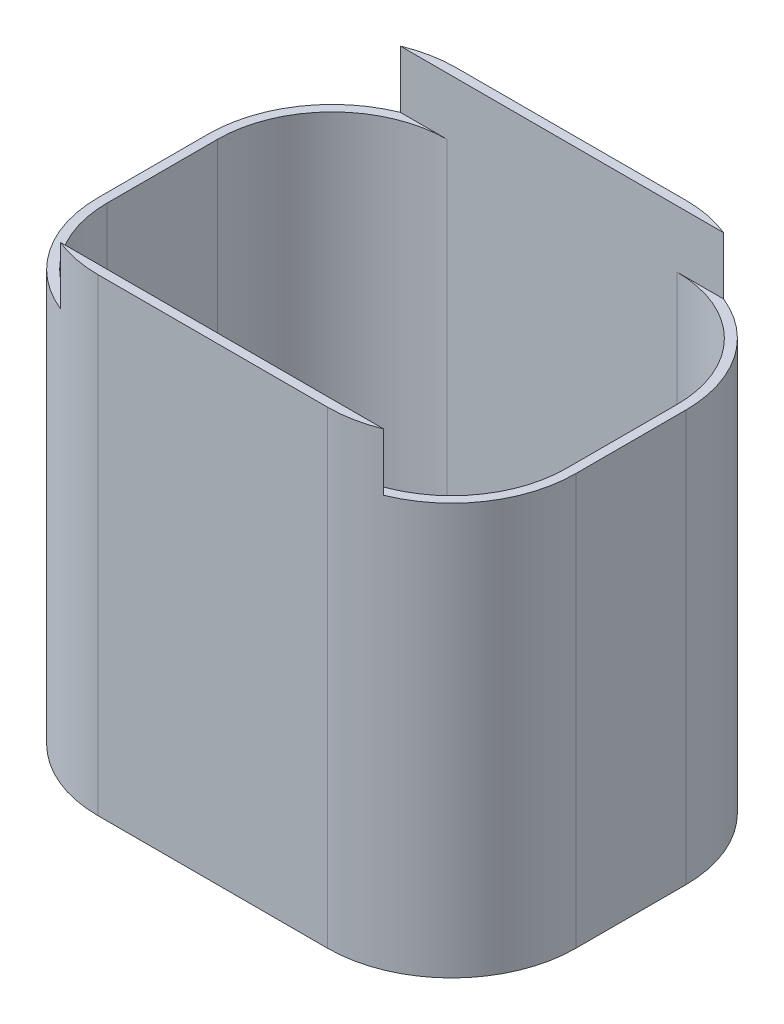
ISO-10303-21;
HEADER;
FILE_DESCRIPTION(('STEP AP214'),'2;1');
FILE_NAME('part.step','',(''),(''),'','','');
FILE_SCHEMA(('AUTOMOTIVE_DESIGN { 1 0 10303 214 1 1 1 1 }'));
ENDSEC;
DATA;
#1=APPLICATION_CONTEXT('core data for automotive mechanical design processes');
#2=APPLICATION_PROTOCOL_DEFINITION('international standard','automotive_design',2000,#1);
#3=PRODUCT_CONTEXT('',#1,'mechanical');
#4=PRODUCT('Part','Part','',(#3));
#5=PRODUCT_RELATED_PRODUCT_CATEGORY('part','',(#4));
#6=PRODUCT_DEFINITION_FORMATION('','',#4);
#7=PRODUCT_DEFINITION_CONTEXT('part definition',#1,'design');
#8=PRODUCT_DEFINITION('design','',#6,#7);
#9=PRODUCT_DEFINITION_SHAPE('','',#8);
#10=(LENGTH_UNIT() NAMED_UNIT(*) SI_UNIT(.MILLI.,.METRE.));
#11=(NAMED_UNIT(*) PLANE_ANGLE_UNIT() SI_UNIT($,.RADIAN.));
#12=(NAMED_UNIT(*) SI_UNIT($,.STERADIAN.) SOLID_ANGLE_UNIT());
#13=UNCERTAINTY_MEASURE_WITH_UNIT(LENGTH_MEASURE(1.E-05),#10,'distance_accuracy_value','');
#14=(GEOMETRIC_REPRESENTATION_CONTEXT(3) GLOBAL_UNCERTAINTY_ASSIGNED_CONTEXT((#13)) GLOBAL_UNIT_ASSIGNED_CONTEXT((#10,
#11,#12)) REPRESENTATION_CONTEXT('',''));
#15=CARTESIAN_POINT('',(0.,0.,0.));
#16=DIRECTION('',(0.,0.,1.));
#17=DIRECTION('',(1.,0.,0.));
#18=AXIS2_PLACEMENT_3D('',#15,#16,#17);
#19=CARTESIAN_POINT('',(-10.,40.8,-4.8));
#20=DIRECTION('',(0.,-1.,0.));
#21=DIRECTION('',(0.,0.,-1.));
#22=AXIS2_PLACEMENT_3D('',#19,#20,#21);
#23=CYLINDRICAL_SURFACE('',#22,10.);
#24=DIRECTION('',(0.,-1.,0.));
#25=VECTOR('',#24,1.);
#26=CARTESIAN_POINT('',(-20.,40.8,-4.8));
#27=LINE('',#26,#25);
#28=CARTESIAN_POINT('',(-20.,35.8,-4.8));
#29=VERTEX_POINT('',#28);
#30=CARTESIAN_POINT('',(-20.,0.8,-4.8));
#31=VERTEX_POINT('',#30);
#32=EDGE_CURVE('E321',#29,#31,#27,.T.);
#33=ORIENTED_EDGE('',*,*,#32,.T.);
#34=CARTESIAN_POINT('',(-10.,0.8,-4.8));
#35=DIRECTION('',(0.,-1.,0.));
#36=DIRECTION('',(0.,0.,-1.));
#37=AXIS2_PLACEMENT_3D('',#34,#35,#36);
#38=CIRCLE('',#37,10.);
#39=CARTESIAN_POINT('',(-10.,0.8,-14.8));
#40=VERTEX_POINT('',#39);
#41=EDGE_CURVE('E236',#31,#40,#38,.T.);
#42=ORIENTED_EDGE('',*,*,#41,.T.);
#43=DIRECTION('',(0.,-1.,0.));
#44=VECTOR('',#43,1.);
#45=CARTESIAN_POINT('',(-10.,40.8,-14.8));
#46=LINE('',#45,#44);
#47=CARTESIAN_POINT('',(-10.,35.8,-14.8));
#48=VERTEX_POINT('',#47);
#49=EDGE_CURVE('E300',#48,#40,#46,.T.);
#50=ORIENTED_EDGE('',*,*,#49,.F.);
#51=CARTESIAN_POINT('',(-10.,35.8,-4.8));
#52=DIRECTION('',(0.,-1.,0.));
#53=DIRECTION('',(0.,0.,-1.));
#54=AXIS2_PLACEMENT_3D('',#51,#52,#53);
#55=CIRCLE('',#54,10.);
#56=EDGE_CURVE('E270',#29,#48,#55,.T.);
#57=ORIENTED_EDGE('',*,*,#56,.F.);
#58=EDGE_LOOP('',(#33,#42,#50,#57));
#59=FACE_BOUND('',#58,.T.);
#60=ADVANCED_FACE('F35',(#59),#23,.F.);
#61=CARTESIAN_POINT('',(-20.,40.8,4.8));
#62=DIRECTION('',(1.,0.,0.));
#63=DIRECTION('',(0.,0.,-1.));
#64=AXIS2_PLACEMENT_3D('',#61,#62,#63);
#65=PLANE('',#64);
#66=DIRECTION('',(0.,-1.,0.));
#67=VECTOR('',#66,1.);
#68=CARTESIAN_POINT('',(-20.,40.8,4.8));
#69=LINE('',#68,#67);
#70=CARTESIAN_POINT('',(-20.,35.8,4.8));
#71=VERTEX_POINT('',#70);
#72=CARTESIAN_POINT('',(-20.,0.8,4.8));
#73=VERTEX_POINT('',#72);
#74=EDGE_CURVE('E318',#71,#73,#69,.T.);
#75=ORIENTED_EDGE('',*,*,#74,.T.);
#76=DIRECTION('',(0.,0.,-1.));
#77=VECTOR('',#76,1.);
#78=CARTESIAN_POINT('',(-20.,0.8,-4.8));
#79=LINE('',#78,#77);
#80=EDGE_CURVE('E233',#73,#31,#79,.T.);
#81=ORIENTED_EDGE('',*,*,#80,.T.);
#82=ORIENTED_EDGE('',*,*,#32,.F.);
#83=DIRECTION('',(0.,0.,-1.));
#84=VECTOR('',#83,1.);
#85=CARTESIAN_POINT('',(-20.,35.8,4.8));
#86=LINE('',#85,#84);
#87=EDGE_CURVE('E268',#71,#29,#86,.T.);
#88=ORIENTED_EDGE('',*,*,#87,.F.);
#89=EDGE_LOOP('',(#75,#81,#82,#88));
#90=FACE_BOUND('',#89,.T.);
#91=ADVANCED_FACE('F400',(#90),#65,.T.);
#92=CARTESIAN_POINT('',(-10.,40.8,4.8));
#93=DIRECTION('',(0.,-1.,0.));
#94=DIRECTION('',(0.,0.,-1.));
#95=AXIS2_PLACEMENT_3D('',#92,#93,#94);
#96=CYLINDRICAL_SURFACE('',#95,10.);
#97=DIRECTION('',(0.,-1.,0.));
#98=VECTOR('',#97,1.);
#99=CARTESIAN_POINT('',(-9.99999999999999,40.8,14.8));
#100=LINE('',#99,#98);
#101=CARTESIAN_POINT('',(-9.99999999999999,35.8,14.8));
#102=VERTEX_POINT('',#101);
#103=CARTESIAN_POINT('',(-9.99999999999999,0.8,14.8));
#104=VERTEX_POINT('',#103);
#105=EDGE_CURVE('E315',#102,#104,#100,.T.);
#106=ORIENTED_EDGE('',*,*,#105,.T.);
#107=CARTESIAN_POINT('',(-10.,0.8,4.8));
#108=DIRECTION('',(0.,-1.,0.));
#109=DIRECTION('',(0.,0.,-1.));
#110=AXIS2_PLACEMENT_3D('',#107,#108,#109);
#111=CIRCLE('',#110,10.);
#112=EDGE_CURVE('E230',#104,#73,#111,.T.);
#113=ORIENTED_EDGE('',*,*,#112,.T.);
#114=ORIENTED_EDGE('',*,*,#74,.F.);
#115=CARTESIAN_POINT('',(-10.,35.8,4.8));
#116=DIRECTION('',(0.,-1.,0.));
#117=DIRECTION('',(0.,0.,-1.));
#118=AXIS2_PLACEMENT_3D('',#115,#116,#117);
#119=CIRCLE('',#118,10.);
#120=EDGE_CURVE('E266',#102,#71,#119,.T.);
#121=ORIENTED_EDGE('',*,*,#120,.F.);
#122=EDGE_LOOP('',(#106,#113,#114,#121));
#123=FACE_BOUND('',#122,.T.);
#124=ADVANCED_FACE('F406',(#123),#96,.F.);
#125=CARTESIAN_POINT('',(-10.,40.8,14.8));
#126=DIRECTION('',(0.,0.,-1.));
#127=DIRECTION('',(-1.,0.,0.));
#128=AXIS2_PLACEMENT_3D('',#125,#126,#127);
#129=PLANE('',#128);
#130=DIRECTION('',(0.,-1.,0.));
#131=VECTOR('',#130,1.);
#132=CARTESIAN_POINT('',(10.,40.8,14.8));
#133=LINE('',#132,#131);
#134=CARTESIAN_POINT('',(10.,35.8,14.8));
#135=VERTEX_POINT('',#134);
#136=CARTESIAN_POINT('',(10.,0.8,14.8));
#137=VERTEX_POINT('',#136);
#138=EDGE_CURVE('E312',#135,#137,#133,.T.);
#139=ORIENTED_EDGE('',*,*,#138,.T.);
#140=DIRECTION('',(-1.,0.,0.));
#141=VECTOR('',#140,1.);
#142=CARTESIAN_POINT('',(-9.99999999999999,0.8,14.8));
#143=LINE('',#142,#141);
#144=EDGE_CURVE('E227',#137,#104,#143,.T.);
#145=ORIENTED_EDGE('',*,*,#144,.T.);
#146=ORIENTED_EDGE('',*,*,#105,.F.);
#147=DIRECTION('',(1.,0.,0.));
#148=VECTOR('',#147,1.);
#149=CARTESIAN_POINT('',(-20.8,35.8,14.8));
#150=LINE('',#149,#148);
#151=CARTESIAN_POINT('',(-14.0792156108742,35.8,14.8));
#152=VERTEX_POINT('',#151);
#153=EDGE_CURVE('E259',#152,#102,#150,.T.);
#154=ORIENTED_EDGE('',*,*,#153,.F.);
#155=DIRECTION('',(0.,-1.,0.));
#156=VECTOR('',#155,1.);
#157=CARTESIAN_POINT('',(-14.0792156108742,40.8,14.8));
#158=LINE('',#157,#156);
#159=CARTESIAN_POINT('',(-14.0792156108742,40.8,14.8));
#160=VERTEX_POINT('',#159);
#161=EDGE_CURVE('E293',#160,#152,#158,.T.);
#162=ORIENTED_EDGE('',*,*,#161,.F.);
#163=DIRECTION('',(1.,0.,0.));
#164=VECTOR('',#163,1.);
#165=CARTESIAN_POINT('',(-10.,40.8,14.8));
#166=LINE('',#165,#164);
#167=CARTESIAN_POINT('',(14.0792156108742,40.8,14.8));
#168=VERTEX_POINT('',#167);
#169=EDGE_CURVE('E296',#160,#168,#166,.T.);
#170=ORIENTED_EDGE('',*,*,#169,.T.);
#171=DIRECTION('',(0.,-1.,0.));
#172=VECTOR('',#171,1.);
#173=CARTESIAN_POINT('',(14.0792156108742,40.8,14.8));
#174=LINE('',#173,#172);
#175=CARTESIAN_POINT('',(14.0792156108742,35.8,14.8));
#176=VERTEX_POINT('',#175);
#177=EDGE_CURVE('E290',#176,#168,#174,.F.);
#178=ORIENTED_EDGE('',*,*,#177,.F.);
#179=EDGE_CURVE('E256',#135,#176,#150,.T.);
#180=ORIENTED_EDGE('',*,*,#179,.F.);
#181=EDGE_LOOP('',(#139,#145,#146,#154,#162,#170,#178,#180));
#182=FACE_BOUND('',#181,.T.);
#183=ADVANCED_FACE('F466',(#182),#129,.T.);
#184=CARTESIAN_POINT('',(10.,40.8,4.8));
#185=DIRECTION('',(0.,-1.,0.));
#186=DIRECTION('',(0.,0.,-1.));
#187=AXIS2_PLACEMENT_3D('',#184,#185,#186);
#188=CYLINDRICAL_SURFACE('',#187,10.);
#189=DIRECTION('',(0.,-1.,0.));
#190=VECTOR('',#189,1.);
#191=CARTESIAN_POINT('',(20.,40.8,4.8));
#192=LINE('',#191,#190);
#193=CARTESIAN_POINT('',(20.,35.8,4.8));
#194=VERTEX_POINT('',#193);
#195=CARTESIAN_POINT('',(20.,0.8,4.8));
#196=VERTEX_POINT('',#195);
#197=EDGE_CURVE('E309',#194,#196,#192,.T.);
#198=ORIENTED_EDGE('',*,*,#197,.T.);
#199=CARTESIAN_POINT('',(10.,0.8,4.8));
#200=DIRECTION('',(0.,-1.,0.));
#201=DIRECTION('',(0.,0.,-1.));
#202=AXIS2_PLACEMENT_3D('',#199,#200,#201);
#203=CIRCLE('',#202,10.);
#204=EDGE_CURVE('E222',#196,#137,#203,.T.);
#205=ORIENTED_EDGE('',*,*,#204,.T.);
#206=ORIENTED_EDGE('',*,*,#138,.F.);
#207=CARTESIAN_POINT('',(10.,35.8,4.8));
#208=DIRECTION('',(0.,-1.,0.));
#209=DIRECTION('',(0.,0.,-1.));
#210=AXIS2_PLACEMENT_3D('',#207,#208,#209);
#211=CIRCLE('',#210,10.);
#212=EDGE_CURVE('E264',#194,#135,#211,.T.);
#213=ORIENTED_EDGE('',*,*,#212,.F.);
#214=EDGE_LOOP('',(#198,#205,#206,#213));
#215=FACE_BOUND('',#214,.T.);
#216=ADVANCED_FACE('F468',(#215),#188,.F.);
#217=CARTESIAN_POINT('',(20.,40.8,4.8));
#218=DIRECTION('',(-1.,0.,0.));
#219=DIRECTION('',(0.,0.,1.));
#220=AXIS2_PLACEMENT_3D('',#217,#218,#219);
#221=PLANE('',#220);
#222=DIRECTION('',(0.,-1.,0.));
#223=VECTOR('',#222,1.);
#224=CARTESIAN_POINT('',(20.,40.8,-4.8));
#225=LINE('',#224,#223);
#226=CARTESIAN_POINT('',(20.,35.8,-4.8));
#227=VERTEX_POINT('',#226);
#228=CARTESIAN_POINT('',(20.,0.8,-4.8));
#229=VERTEX_POINT('',#228);
#230=EDGE_CURVE('E306',#227,#229,#225,.T.);
#231=ORIENTED_EDGE('',*,*,#230,.T.);
#232=DIRECTION('',(0.,0.,1.));
#233=VECTOR('',#232,1.);
#234=CARTESIAN_POINT('',(20.,0.8,4.8));
#235=LINE('',#234,#233);
#236=EDGE_CURVE('E245',#229,#196,#235,.T.);
#237=ORIENTED_EDGE('',*,*,#236,.T.);
#238=ORIENTED_EDGE('',*,*,#197,.F.);
#239=DIRECTION('',(0.,0.,1.));
#240=VECTOR('',#239,1.);
#241=CARTESIAN_POINT('',(20.,35.8,4.8));
#242=LINE('',#241,#240);
#243=EDGE_CURVE('E262',#227,#194,#242,.T.);
#244=ORIENTED_EDGE('',*,*,#243,.F.);
#245=EDGE_LOOP('',(#231,#237,#238,#244));
#246=FACE_BOUND('',#245,.T.);
#247=ADVANCED_FACE('F471',(#246),#221,.T.);
#248=CARTESIAN_POINT('',(10.,40.8,-4.8));
#249=DIRECTION('',(0.,-1.,0.));
#250=DIRECTION('',(0.,0.,-1.));
#251=AXIS2_PLACEMENT_3D('',#248,#249,#250);
#252=CYLINDRICAL_SURFACE('',#251,10.);
#253=DIRECTION('',(0.,-1.,0.));
#254=VECTOR('',#253,1.);
#255=CARTESIAN_POINT('',(10.,40.8,-14.8));
#256=LINE('',#255,#254);
#257=CARTESIAN_POINT('',(10.,35.8,-14.8));
#258=VERTEX_POINT('',#257);
#259=CARTESIAN_POINT('',(10.,0.800000000000002,-14.8));
#260=VERTEX_POINT('',#259);
#261=EDGE_CURVE('E303',#258,#260,#256,.T.);
#262=ORIENTED_EDGE('',*,*,#261,.T.);
#263=CARTESIAN_POINT('',(10.,0.8,-4.8));
#264=DIRECTION('',(0.,-1.,0.));
#265=DIRECTION('',(0.,0.,-1.));
#266=AXIS2_PLACEMENT_3D('',#263,#264,#265);
#267=CIRCLE('',#266,10.);
#268=EDGE_CURVE('E242',#260,#229,#267,.T.);
#269=ORIENTED_EDGE('',*,*,#268,.T.);
#270=ORIENTED_EDGE('',*,*,#230,.F.);
#271=CARTESIAN_POINT('',(10.,35.8,-4.8));
#272=DIRECTION('',(0.,-1.,0.));
#273=DIRECTION('',(0.,0.,-1.));
#274=AXIS2_PLACEMENT_3D('',#271,#272,#273);
#275=CIRCLE('',#274,10.);
#276=EDGE_CURVE('E260',#258,#227,#275,.T.);
#277=ORIENTED_EDGE('',*,*,#276,.F.);
#278=EDGE_LOOP('',(#262,#269,#270,#277));
#279=FACE_BOUND('',#278,.T.);
#280=ADVANCED_FACE('F476',(#279),#252,.F.);
#281=CARTESIAN_POINT('',(-10.,40.8,-14.8));
#282=DIRECTION('',(0.,0.,1.));
#283=DIRECTION('',(1.,0.,0.));
#284=AXIS2_PLACEMENT_3D('',#281,#282,#283);
#285=PLANE('',#284);
#286=ORIENTED_EDGE('',*,*,#49,.T.);
#287=DIRECTION('',(1.,0.,0.));
#288=VECTOR('',#287,1.);
#289=CARTESIAN_POINT('',(10.,0.8,-14.8));
#290=LINE('',#289,#288);
#291=EDGE_CURVE('E239',#40,#260,#290,.T.);
#292=ORIENTED_EDGE('',*,*,#291,.T.);
#293=ORIENTED_EDGE('',*,*,#261,.F.);
#294=DIRECTION('',(-1.,0.,0.));
#295=VECTOR('',#294,1.);
#296=CARTESIAN_POINT('',(-20.8,35.8,-14.8));
#297=LINE('',#296,#295);
#298=CARTESIAN_POINT('',(14.0792156108742,35.8,-14.8));
#299=VERTEX_POINT('',#298);
#300=EDGE_CURVE('E253',#299,#258,#297,.T.);
#301=ORIENTED_EDGE('',*,*,#300,.F.);
#302=DIRECTION('',(0.,-1.,0.));
#303=VECTOR('',#302,1.);
#304=CARTESIAN_POINT('',(14.0792156108742,40.8,-14.8));
#305=LINE('',#304,#303);
#306=CARTESIAN_POINT('',(14.0792156108742,40.8,-14.8));
#307=VERTEX_POINT('',#306);
#308=EDGE_CURVE('E287',#307,#299,#305,.T.);
#309=ORIENTED_EDGE('',*,*,#308,.F.);
#310=DIRECTION('',(-1.,0.,0.));
#311=VECTOR('',#310,1.);
#312=CARTESIAN_POINT('',(-10.,40.8,-14.8));
#313=LINE('',#312,#311);
#314=CARTESIAN_POINT('',(-14.0792156108742,40.8,-14.8));
#315=VERTEX_POINT('',#314);
#316=EDGE_CURVE('E298',#307,#315,#313,.T.);
#317=ORIENTED_EDGE('',*,*,#316,.T.);
#318=DIRECTION('',(0.,-1.,0.));
#319=VECTOR('',#318,1.);
#320=CARTESIAN_POINT('',(-14.0792156108742,40.8,-14.8));
#321=LINE('',#320,#319);
#322=CARTESIAN_POINT('',(-14.0792156108742,35.8,-14.8));
#323=VERTEX_POINT('',#322);
#324=EDGE_CURVE('E284',#323,#315,#321,.F.);
#325=ORIENTED_EDGE('',*,*,#324,.F.);
#326=EDGE_CURVE('E250',#48,#323,#297,.T.);
#327=ORIENTED_EDGE('',*,*,#326,.F.);
#328=EDGE_LOOP('',(#286,#292,#293,#301,#309,#317,#325,#327));
#329=FACE_BOUND('',#328,.T.);
#330=ADVANCED_FACE('F479',(#329),#285,.T.);
#331=CARTESIAN_POINT('',(-10.,40.8,4.8));
#332=DIRECTION('',(0.,-1.,0.));
#333=DIRECTION('',(0.,0.,-1.));
#334=AXIS2_PLACEMENT_3D('',#331,#332,#333);
#335=PLANE('',#334);
#336=CARTESIAN_POINT('',(10.,40.8,4.8));
#337=DIRECTION('',(0.,1.,0.));
#338=DIRECTION('',(0.,0.,-1.));
#339=AXIS2_PLACEMENT_3D('',#336,#337,#338);
#340=CIRCLE('',#339,10.8);
#341=CARTESIAN_POINT('',(10.,40.8,15.6));
#342=VERTEX_POINT('',#341);
#343=EDGE_CURVE('E330',#342,#168,#340,.T.);
#344=ORIENTED_EDGE('',*,*,#343,.T.);
#345=ORIENTED_EDGE('',*,*,#169,.F.);
#346=CARTESIAN_POINT('',(-10.,40.8,4.8));
#347=DIRECTION('',(0.,1.,0.));
#348=DIRECTION('',(0.,0.,-1.));
#349=AXIS2_PLACEMENT_3D('',#346,#347,#348);
#350=CIRCLE('',#349,10.8);
#351=CARTESIAN_POINT('',(-10.,40.8,15.6));
#352=VERTEX_POINT('',#351);
#353=EDGE_CURVE('E325',#160,#352,#350,.T.);
#354=ORIENTED_EDGE('',*,*,#353,.T.);
#355=DIRECTION('',(1.,0.,0.));
#356=VECTOR('',#355,1.);
#357=CARTESIAN_POINT('',(-10.,40.8,15.6));
#358=LINE('',#357,#356);
#359=EDGE_CURVE('E327',#352,#342,#358,.T.);
#360=ORIENTED_EDGE('',*,*,#359,.T.);
#361=EDGE_LOOP('',(#344,#345,#354,#360));
#362=FACE_BOUND('',#361,.T.);
#363=ADVANCED_FACE('F414',(#362),#335,.F.);
#364=CARTESIAN_POINT('',(-10.,40.8,-4.8));
#365=DIRECTION('',(0.,1.,0.));
#366=DIRECTION('',(0.,0.,-1.));
#367=AXIS2_PLACEMENT_3D('',#364,#365,#366);
#368=CIRCLE('',#367,10.8);
#369=CARTESIAN_POINT('',(-10.,40.8,-15.6));
#370=VERTEX_POINT('',#369);
#371=EDGE_CURVE('E337',#370,#315,#368,.T.);
#372=ORIENTED_EDGE('',*,*,#371,.T.);
#373=ORIENTED_EDGE('',*,*,#316,.F.);
#374=CARTESIAN_POINT('',(10.,40.8,-4.8));
#375=DIRECTION('',(0.,1.,0.));
#376=DIRECTION('',(0.,0.,-1.));
#377=AXIS2_PLACEMENT_3D('',#374,#375,#376);
#378=CIRCLE('',#377,10.8);
#379=CARTESIAN_POINT('',(10.,40.8,-15.6));
#380=VERTEX_POINT('',#379);
#381=EDGE_CURVE('E333',#307,#380,#378,.T.);
#382=ORIENTED_EDGE('',*,*,#381,.T.);
#383=DIRECTION('',(-1.,0.,0.));
#384=VECTOR('',#383,1.);
#385=CARTESIAN_POINT('',(-10.,40.8,-15.6));
#386=LINE('',#385,#384);
#387=EDGE_CURVE('E335',#380,#370,#386,.T.);
#388=ORIENTED_EDGE('',*,*,#387,.T.);
#389=EDGE_LOOP('',(#372,#373,#382,#388));
#390=FACE_BOUND('',#389,.T.);
#391=ADVANCED_FACE('F411',(#390),#335,.F.);
#392=CARTESIAN_POINT('',(-10.,0.,4.8));
#393=DIRECTION('',(0.,-1.,0.));
#394=DIRECTION('',(0.,0.,-1.));
#395=AXIS2_PLACEMENT_3D('',#392,#393,#394);
#396=PLANE('',#395);
#397=CARTESIAN_POINT('',(0.,0.,7.1));
#398=DIRECTION('',(0.,-1.,0.));
#399=DIRECTION('',(0.,0.,-1.));
#400=AXIS2_PLACEMENT_3D('',#397,#398,#399);
#401=CIRCLE('',#400,7.4);
#402=CARTESIAN_POINT('',(7.4,0.,7.1));
#403=VERTEX_POINT('',#402);
#404=CARTESIAN_POINT('',(-7.4,0.,7.1));
#405=VERTEX_POINT('',#404);
#406=EDGE_CURVE('E50',#403,#405,#401,.T.);
#407=ORIENTED_EDGE('',*,*,#406,.F.);
#408=DIRECTION('',(0.,0.,1.));
#409=VECTOR('',#408,1.);
#410=CARTESIAN_POINT('',(7.4,0.,7.1));
#411=LINE('',#410,#409);
#412=CARTESIAN_POINT('',(7.4,0.,-7.1));
#413=VERTEX_POINT('',#412);
#414=EDGE_CURVE('E215',#413,#403,#411,.T.);
#415=ORIENTED_EDGE('',*,*,#414,.F.);
#416=CARTESIAN_POINT('',(0.,0.,-7.1));
#417=DIRECTION('',(0.,-1.,0.));
#418=DIRECTION('',(0.,0.,-1.));
#419=AXIS2_PLACEMENT_3D('',#416,#417,#418);
#420=CIRCLE('',#419,7.4);
#421=CARTESIAN_POINT('',(-7.4,0.,-7.1));
#422=VERTEX_POINT('',#421);
#423=EDGE_CURVE('E199',#422,#413,#420,.T.);
#424=ORIENTED_EDGE('',*,*,#423,.F.);
#425=DIRECTION('',(0.,0.,-1.));
#426=VECTOR('',#425,1.);
#427=CARTESIAN_POINT('',(-7.4,0.,7.1));
#428=LINE('',#427,#426);
#429=EDGE_CURVE('E208',#405,#422,#428,.T.);
#430=ORIENTED_EDGE('',*,*,#429,.F.);
#431=EDGE_LOOP('',(#407,#415,#424,#430));
#432=FACE_BOUND('',#431,.T.);
#433=CARTESIAN_POINT('',(-10.,0.,4.8));
#434=DIRECTION('',(0.,1.,0.));
#435=DIRECTION('',(0.,0.,-1.));
#436=AXIS2_PLACEMENT_3D('',#433,#434,#435);
#437=CIRCLE('',#436,10.8);
#438=CARTESIAN_POINT('',(-20.8,0.,4.8));
#439=VERTEX_POINT('',#438);
#440=CARTESIAN_POINT('',(-10.,0.,15.6));
#441=VERTEX_POINT('',#440);
#442=EDGE_CURVE('E324',#439,#441,#437,.T.);
#443=ORIENTED_EDGE('',*,*,#442,.F.);
#444=DIRECTION('',(0.,0.,1.));
#445=VECTOR('',#444,1.);
#446=CARTESIAN_POINT('',(-20.8,0.,4.8));
#447=LINE('',#446,#445);
#448=CARTESIAN_POINT('',(-20.8,0.,-4.8));
#449=VERTEX_POINT('',#448);
#450=EDGE_CURVE('E328',#449,#439,#447,.T.);
#451=ORIENTED_EDGE('',*,*,#450,.F.);
#452=CARTESIAN_POINT('',(-10.,0.,-4.8));
#453=DIRECTION('',(0.,1.,0.));
#454=DIRECTION('',(0.,0.,-1.));
#455=AXIS2_PLACEMENT_3D('',#452,#453,#454);
#456=CIRCLE('',#455,10.8);
#457=CARTESIAN_POINT('',(-10.,0.,-15.6));
#458=VERTEX_POINT('',#457);
#459=EDGE_CURVE('E355',#458,#449,#456,.T.);
#460=ORIENTED_EDGE('',*,*,#459,.F.);
#461=DIRECTION('',(-1.,0.,0.));
#462=VECTOR('',#461,1.);
#463=CARTESIAN_POINT('',(-10.,0.,-15.6));
#464=LINE('',#463,#462);
#465=CARTESIAN_POINT('',(10.,0.,-15.6));
#466=VERTEX_POINT('',#465);
#467=EDGE_CURVE('E353',#466,#458,#464,.T.);
#468=ORIENTED_EDGE('',*,*,#467,.F.);
#469=CARTESIAN_POINT('',(10.,0.,-4.8));
#470=DIRECTION('',(0.,1.,0.));
#471=DIRECTION('',(0.,0.,-1.));
#472=AXIS2_PLACEMENT_3D('',#469,#470,#471);
#473=CIRCLE('',#472,10.8);
#474=CARTESIAN_POINT('',(20.8,0.,-4.8));
#475=VERTEX_POINT('',#474);
#476=EDGE_CURVE('E351',#475,#466,#473,.T.);
#477=ORIENTED_EDGE('',*,*,#476,.F.);
#478=DIRECTION('',(0.,0.,-1.));
#479=VECTOR('',#478,1.);
#480=CARTESIAN_POINT('',(20.8,0.,4.8));
#481=LINE('',#480,#479);
#482=CARTESIAN_POINT('',(20.8,0.,4.8));
#483=VERTEX_POINT('',#482);
#484=EDGE_CURVE('E348',#483,#475,#481,.T.);
#485=ORIENTED_EDGE('',*,*,#484,.F.);
#486=CARTESIAN_POINT('',(10.,0.,4.8));
#487=DIRECTION('',(0.,1.,0.));
#488=DIRECTION('',(0.,0.,-1.));
#489=AXIS2_PLACEMENT_3D('',#486,#487,#488);
#490=CIRCLE('',#489,10.8);
#491=CARTESIAN_POINT('',(10.,0.,15.6));
#492=VERTEX_POINT('',#491);
#493=EDGE_CURVE('E345',#492,#483,#490,.T.);
#494=ORIENTED_EDGE('',*,*,#493,.F.);
#495=DIRECTION('',(1.,0.,0.));
#496=VECTOR('',#495,1.);
#497=CARTESIAN_POINT('',(-10.,0.,15.6));
#498=LINE('',#497,#496);
#499=EDGE_CURVE('E343',#441,#492,#498,.T.);
#500=ORIENTED_EDGE('',*,*,#499,.F.);
#501=EDGE_LOOP('',(#443,#451,#460,#468,#477,#485,#494,#500));
#502=FACE_BOUND('',#501,.T.);
#503=ADVANCED_FACE('F212',(#432,#502),#396,.T.);
#504=CARTESIAN_POINT('',(-10.,40.8,4.8));
#505=DIRECTION('',(0.,-1.,0.));
#506=DIRECTION('',(0.,0.,-1.));
#507=AXIS2_PLACEMENT_3D('',#504,#505,#506);
#508=CYLINDRICAL_SURFACE('',#507,10.8);
#509=ORIENTED_EDGE('',*,*,#353,.F.);
#510=ORIENTED_EDGE('',*,*,#161,.T.);
#511=CARTESIAN_POINT('',(-10.,35.8,4.8));
#512=DIRECTION('',(0.,-1.,0.));
#513=DIRECTION('',(0.,0.,-1.));
#514=AXIS2_PLACEMENT_3D('',#511,#512,#513);
#515=CIRCLE('',#514,10.8);
#516=CARTESIAN_POINT('',(-20.8,35.8,4.8));
#517=VERTEX_POINT('',#516);
#518=EDGE_CURVE('E281',#152,#517,#515,.T.);
#519=ORIENTED_EDGE('',*,*,#518,.T.);
#520=DIRECTION('',(0.,-1.,0.));
#521=VECTOR('',#520,1.);
#522=CARTESIAN_POINT('',(-20.8,40.8,4.8));
#523=LINE('',#522,#521);
#524=EDGE_CURVE('E340',#517,#439,#523,.T.);
#525=ORIENTED_EDGE('',*,*,#524,.T.);
#526=ORIENTED_EDGE('',*,*,#442,.T.);
#527=DIRECTION('',(0.,-1.,0.));
#528=VECTOR('',#527,1.);
#529=CARTESIAN_POINT('',(-10.,40.8,15.6));
#530=LINE('',#529,#528);
#531=EDGE_CURVE('E376',#352,#441,#530,.T.);
#532=ORIENTED_EDGE('',*,*,#531,.F.);
#533=EDGE_LOOP('',(#509,#510,#519,#525,#526,#532));
#534=FACE_BOUND('',#533,.T.);
#535=ADVANCED_FACE('F37',(#534),#508,.T.);
#536=CARTESIAN_POINT('',(-10.,40.8,15.6));
#537=DIRECTION('',(0.,0.,-1.));
#538=DIRECTION('',(-1.,0.,0.));
#539=AXIS2_PLACEMENT_3D('',#536,#537,#538);
#540=PLANE('',#539);
#541=ORIENTED_EDGE('',*,*,#499,.T.);
#542=DIRECTION('',(0.,-1.,0.));
#543=VECTOR('',#542,1.);
#544=CARTESIAN_POINT('',(10.,40.8,15.6));
#545=LINE('',#544,#543);
#546=EDGE_CURVE('E373',#342,#492,#545,.T.);
#547=ORIENTED_EDGE('',*,*,#546,.F.);
#548=ORIENTED_EDGE('',*,*,#359,.F.);
#549=ORIENTED_EDGE('',*,*,#531,.T.);
#550=EDGE_LOOP('',(#541,#547,#548,#549));
#551=FACE_BOUND('',#550,.T.);
#552=ADVANCED_FACE('F441',(#551),#540,.F.);
#553=CARTESIAN_POINT('',(10.,40.8,4.8));
#554=DIRECTION('',(0.,-1.,0.));
#555=DIRECTION('',(0.,0.,-1.));
#556=AXIS2_PLACEMENT_3D('',#553,#554,#555);
#557=CYLINDRICAL_SURFACE('',#556,10.8);
#558=CARTESIAN_POINT('',(10.,35.8,4.8));
#559=DIRECTION('',(0.,-1.,0.));
#560=DIRECTION('',(0.,0.,-1.));
#561=AXIS2_PLACEMENT_3D('',#558,#559,#560);
#562=CIRCLE('',#561,10.8);
#563=CARTESIAN_POINT('',(20.8,35.8,4.8));
#564=VERTEX_POINT('',#563);
#565=EDGE_CURVE('E278',#564,#176,#562,.T.);
#566=ORIENTED_EDGE('',*,*,#565,.T.);
#567=ORIENTED_EDGE('',*,*,#177,.T.);
#568=ORIENTED_EDGE('',*,*,#343,.F.);
#569=ORIENTED_EDGE('',*,*,#546,.T.);
#570=ORIENTED_EDGE('',*,*,#493,.T.);
#571=DIRECTION('',(0.,-1.,0.));
#572=VECTOR('',#571,1.);
#573=CARTESIAN_POINT('',(20.8,40.8,4.8));
#574=LINE('',#573,#572);
#575=EDGE_CURVE('E371',#564,#483,#574,.T.);
#576=ORIENTED_EDGE('',*,*,#575,.F.);
#577=EDGE_LOOP('',(#566,#567,#568,#569,#570,#576));
#578=FACE_BOUND('',#577,.T.);
#579=ADVANCED_FACE('F438',(#578),#557,.T.);
#580=CARTESIAN_POINT('',(20.8,40.8,4.8));
#581=DIRECTION('',(-1.,0.,0.));
#582=DIRECTION('',(0.,0.,1.));
#583=AXIS2_PLACEMENT_3D('',#580,#581,#582);
#584=PLANE('',#583);
#585=DIRECTION('',(0.,-1.,0.));
#586=VECTOR('',#585,1.);
#587=CARTESIAN_POINT('',(20.8,40.8,-4.8));
#588=LINE('',#587,#586);
#589=CARTESIAN_POINT('',(20.8,35.8,-4.8));
#590=VERTEX_POINT('',#589);
#591=EDGE_CURVE('E369',#590,#475,#588,.T.);
#592=ORIENTED_EDGE('',*,*,#591,.F.);
#593=DIRECTION('',(0.,0.,-1.));
#594=VECTOR('',#593,1.);
#595=CARTESIAN_POINT('',(20.8,35.8,14.8));
#596=LINE('',#595,#594);
#597=EDGE_CURVE('E248',#564,#590,#596,.T.);
#598=ORIENTED_EDGE('',*,*,#597,.F.);
#599=ORIENTED_EDGE('',*,*,#575,.T.);
#600=ORIENTED_EDGE('',*,*,#484,.T.);
#601=EDGE_LOOP('',(#592,#598,#599,#600));
#602=FACE_BOUND('',#601,.T.);
#603=ADVANCED_FACE('F434',(#602),#584,.F.);
#604=CARTESIAN_POINT('',(10.,40.8,-4.8));
#605=DIRECTION('',(0.,-1.,0.));
#606=DIRECTION('',(0.,0.,-1.));
#607=AXIS2_PLACEMENT_3D('',#604,#605,#606);
#608=CYLINDRICAL_SURFACE('',#607,10.8);
#609=ORIENTED_EDGE('',*,*,#381,.F.);
#610=ORIENTED_EDGE('',*,*,#308,.T.);
#611=CARTESIAN_POINT('',(10.,35.8,-4.8));
#612=DIRECTION('',(0.,-1.,0.));
#613=DIRECTION('',(0.,0.,-1.));
#614=AXIS2_PLACEMENT_3D('',#611,#612,#613);
#615=CIRCLE('',#614,10.8);
#616=EDGE_CURVE('E275',#299,#590,#615,.T.);
#617=ORIENTED_EDGE('',*,*,#616,.T.);
#618=ORIENTED_EDGE('',*,*,#591,.T.);
#619=ORIENTED_EDGE('',*,*,#476,.T.);
#620=DIRECTION('',(0.,-1.,0.));
#621=VECTOR('',#620,1.);
#622=CARTESIAN_POINT('',(10.,40.8,-15.6));
#623=LINE('',#622,#621);
#624=EDGE_CURVE('E366',#380,#466,#623,.T.);
#625=ORIENTED_EDGE('',*,*,#624,.F.);
#626=EDGE_LOOP('',(#609,#610,#617,#618,#619,#625));
#627=FACE_BOUND('',#626,.T.);
#628=ADVANCED_FACE('F430',(#627),#608,.T.);
#629=CARTESIAN_POINT('',(-10.,40.8,-15.6));
#630=DIRECTION('',(0.,0.,1.));
#631=DIRECTION('',(1.,0.,0.));
#632=AXIS2_PLACEMENT_3D('',#629,#630,#631);
#633=PLANE('',#632);
#634=ORIENTED_EDGE('',*,*,#467,.T.);
#635=DIRECTION('',(0.,-1.,0.));
#636=VECTOR('',#635,1.);
#637=CARTESIAN_POINT('',(-10.,40.8,-15.6));
#638=LINE('',#637,#636);
#639=EDGE_CURVE('E363',#370,#458,#638,.T.);
#640=ORIENTED_EDGE('',*,*,#639,.F.);
#641=ORIENTED_EDGE('',*,*,#387,.F.);
#642=ORIENTED_EDGE('',*,*,#624,.T.);
#643=EDGE_LOOP('',(#634,#640,#641,#642));
#644=FACE_BOUND('',#643,.T.);
#645=ADVANCED_FACE('F426',(#644),#633,.F.);
#646=CARTESIAN_POINT('',(-10.,40.8,-4.8));
#647=DIRECTION('',(0.,-1.,0.));
#648=DIRECTION('',(0.,0.,-1.));
#649=AXIS2_PLACEMENT_3D('',#646,#647,#648);
#650=CYLINDRICAL_SURFACE('',#649,10.8);
#651=CARTESIAN_POINT('',(-10.,35.8,-4.8));
#652=DIRECTION('',(0.,-1.,0.));
#653=DIRECTION('',(0.,0.,-1.));
#654=AXIS2_PLACEMENT_3D('',#651,#652,#653);
#655=CIRCLE('',#654,10.8);
#656=CARTESIAN_POINT('',(-20.8,35.8,-4.8));
#657=VERTEX_POINT('',#656);
#658=EDGE_CURVE('E272',#657,#323,#655,.T.);
#659=ORIENTED_EDGE('',*,*,#658,.T.);
#660=ORIENTED_EDGE('',*,*,#324,.T.);
#661=ORIENTED_EDGE('',*,*,#371,.F.);
#662=ORIENTED_EDGE('',*,*,#639,.T.);
#663=ORIENTED_EDGE('',*,*,#459,.T.);
#664=DIRECTION('',(0.,-1.,0.));
#665=VECTOR('',#664,1.);
#666=CARTESIAN_POINT('',(-20.8,40.8,-4.8));
#667=LINE('',#666,#665);
#668=EDGE_CURVE('E361',#657,#449,#667,.T.);
#669=ORIENTED_EDGE('',*,*,#668,.F.);
#670=EDGE_LOOP('',(#659,#660,#661,#662,#663,#669));
#671=FACE_BOUND('',#670,.T.);
#672=ADVANCED_FACE('F422',(#671),#650,.T.);
#673=CARTESIAN_POINT('',(-20.8,40.8,4.8));
#674=DIRECTION('',(1.,0.,0.));
#675=DIRECTION('',(0.,0.,-1.));
#676=AXIS2_PLACEMENT_3D('',#673,#674,#675);
#677=PLANE('',#676);
#678=ORIENTED_EDGE('',*,*,#524,.F.);
#679=DIRECTION('',(0.,0.,1.));
#680=VECTOR('',#679,1.);
#681=CARTESIAN_POINT('',(-20.8,35.8,14.8));
#682=LINE('',#681,#680);
#683=EDGE_CURVE('E254',#657,#517,#682,.T.);
#684=ORIENTED_EDGE('',*,*,#683,.F.);
#685=ORIENTED_EDGE('',*,*,#668,.T.);
#686=ORIENTED_EDGE('',*,*,#450,.T.);
#687=EDGE_LOOP('',(#678,#684,#685,#686));
#688=FACE_BOUND('',#687,.T.);
#689=ADVANCED_FACE('F418',(#688),#677,.F.);
#690=CARTESIAN_POINT('',(0.,35.8,0.));
#691=DIRECTION('',(0.,-1.,0.));
#692=DIRECTION('',(0.,0.,-1.));
#693=AXIS2_PLACEMENT_3D('',#690,#691,#692);
#694=PLANE('',#693);
#695=ORIENTED_EDGE('',*,*,#597,.T.);
#696=ORIENTED_EDGE('',*,*,#616,.F.);
#697=ORIENTED_EDGE('',*,*,#300,.T.);
#698=ORIENTED_EDGE('',*,*,#276,.T.);
#699=ORIENTED_EDGE('',*,*,#243,.T.);
#700=ORIENTED_EDGE('',*,*,#212,.T.);
#701=ORIENTED_EDGE('',*,*,#179,.T.);
#702=ORIENTED_EDGE('',*,*,#565,.F.);
#703=EDGE_LOOP('',(#695,#696,#697,#698,#699,#700,#701,#702));
#704=FACE_BOUND('',#703,.T.);
#705=ADVANCED_FACE('F421',(#704),#694,.F.);
#706=ORIENTED_EDGE('',*,*,#153,.T.);
#707=ORIENTED_EDGE('',*,*,#120,.T.);
#708=ORIENTED_EDGE('',*,*,#87,.T.);
#709=ORIENTED_EDGE('',*,*,#56,.T.);
#710=ORIENTED_EDGE('',*,*,#326,.T.);
#711=ORIENTED_EDGE('',*,*,#658,.F.);
#712=ORIENTED_EDGE('',*,*,#683,.T.);
#713=ORIENTED_EDGE('',*,*,#518,.F.);
#714=EDGE_LOOP('',(#706,#707,#708,#709,#710,#711,#712,#713));
#715=FACE_BOUND('',#714,.T.);
#716=ADVANCED_FACE('F396',(#715),#694,.F.);
#717=CARTESIAN_POINT('',(10.,0.8,4.8));
#718=DIRECTION('',(0.,-1.,0.));
#719=DIRECTION('',(0.,0.,-1.));
#720=AXIS2_PLACEMENT_3D('',#717,#718,#719);
#721=PLANE('',#720);
#722=DIRECTION('',(0.,0.,1.));
#723=VECTOR('',#722,1.);
#724=CARTESIAN_POINT('',(7.4,0.8,4.8));
#725=LINE('',#724,#723);
#726=CARTESIAN_POINT('',(7.4,0.800000000000002,-7.1));
#727=VERTEX_POINT('',#726);
#728=CARTESIAN_POINT('',(7.4,0.800000000000002,7.1));
#729=VERTEX_POINT('',#728);
#730=EDGE_CURVE('E43',#727,#729,#725,.T.);
#731=ORIENTED_EDGE('',*,*,#730,.T.);
#732=CARTESIAN_POINT('',(0.,0.800000000000002,7.1));
#733=DIRECTION('',(0.,-1.,0.));
#734=DIRECTION('',(0.,0.,-1.));
#735=AXIS2_PLACEMENT_3D('',#732,#733,#734);
#736=CIRCLE('',#735,7.4);
#737=CARTESIAN_POINT('',(-7.4,0.800000000000002,7.1));
#738=VERTEX_POINT('',#737);
#739=EDGE_CURVE('E11',#729,#738,#736,.T.);
#740=ORIENTED_EDGE('',*,*,#739,.T.);
#741=DIRECTION('',(0.,0.,-1.));
#742=VECTOR('',#741,1.);
#743=CARTESIAN_POINT('',(-7.4,0.8,4.8));
#744=LINE('',#743,#742);
#745=CARTESIAN_POINT('',(-7.4,0.8,-7.1));
#746=VERTEX_POINT('',#745);
#747=EDGE_CURVE('E379',#738,#746,#744,.T.);
#748=ORIENTED_EDGE('',*,*,#747,.T.);
#749=CARTESIAN_POINT('',(0.,0.800000000000002,-7.1));
#750=DIRECTION('',(0.,-1.,0.));
#751=DIRECTION('',(0.,0.,-1.));
#752=AXIS2_PLACEMENT_3D('',#749,#750,#751);
#753=CIRCLE('',#752,7.4);
#754=EDGE_CURVE('E202',#746,#727,#753,.T.);
#755=ORIENTED_EDGE('',*,*,#754,.T.);
#756=EDGE_LOOP('',(#731,#740,#748,#755));
#757=FACE_BOUND('',#756,.T.);
#758=ORIENTED_EDGE('',*,*,#204,.F.);
#759=ORIENTED_EDGE('',*,*,#236,.F.);
#760=ORIENTED_EDGE('',*,*,#268,.F.);
#761=ORIENTED_EDGE('',*,*,#291,.F.);
#762=ORIENTED_EDGE('',*,*,#41,.F.);
#763=ORIENTED_EDGE('',*,*,#80,.F.);
#764=ORIENTED_EDGE('',*,*,#112,.F.);
#765=ORIENTED_EDGE('',*,*,#144,.F.);
#766=EDGE_LOOP('',(#758,#759,#760,#761,#762,#763,#764,#765));
#767=FACE_BOUND('',#766,.T.);
#768=ADVANCED_FACE('F383',(#757,#767),#721,.F.);
#769=CARTESIAN_POINT('',(0.,40.8,7.1));
#770=DIRECTION('',(0.,-1.,0.));
#771=DIRECTION('',(0.,0.,-1.));
#772=AXIS2_PLACEMENT_3D('',#769,#770,#771);
#773=CYLINDRICAL_SURFACE('',#772,7.4);
#774=DIRECTION('',(0.,-1.,0.));
#775=VECTOR('',#774,1.);
#776=CARTESIAN_POINT('',(7.4,40.8,7.1));
#777=LINE('',#776,#775);
#778=EDGE_CURVE('E220',#729,#403,#777,.T.);
#779=ORIENTED_EDGE('',*,*,#778,.T.);
#780=ORIENTED_EDGE('',*,*,#406,.T.);
#781=DIRECTION('',(0.,-1.,0.));
#782=VECTOR('',#781,1.);
#783=CARTESIAN_POINT('',(-7.4,40.8,7.1));
#784=LINE('',#783,#782);
#785=EDGE_CURVE('E205',#738,#405,#784,.T.);
#786=ORIENTED_EDGE('',*,*,#785,.F.);
#787=ORIENTED_EDGE('',*,*,#739,.F.);
#788=EDGE_LOOP('',(#779,#780,#786,#787));
#789=FACE_BOUND('',#788,.T.);
#790=ADVANCED_FACE('F388',(#789),#773,.F.);
#791=CARTESIAN_POINT('',(7.4,40.8,7.1));
#792=DIRECTION('',(1.,0.,0.));
#793=DIRECTION('',(0.,0.,-1.));
#794=AXIS2_PLACEMENT_3D('',#791,#792,#793);
#795=PLANE('',#794);
#796=DIRECTION('',(0.,-1.,0.));
#797=VECTOR('',#796,1.);
#798=CARTESIAN_POINT('',(7.4,40.8,-7.1));
#799=LINE('',#798,#797);
#800=EDGE_CURVE('E204',#727,#413,#799,.T.);
#801=ORIENTED_EDGE('',*,*,#800,.T.);
#802=ORIENTED_EDGE('',*,*,#414,.T.);
#803=ORIENTED_EDGE('',*,*,#778,.F.);
#804=ORIENTED_EDGE('',*,*,#730,.F.);
#805=EDGE_LOOP('',(#801,#802,#803,#804));
#806=FACE_BOUND('',#805,.T.);
#807=ADVANCED_FACE('F387',(#806),#795,.F.);
#808=CARTESIAN_POINT('',(0.,40.8,-7.1));
#809=DIRECTION('',(0.,-1.,0.));
#810=DIRECTION('',(0.,0.,-1.));
#811=AXIS2_PLACEMENT_3D('',#808,#809,#810);
#812=CYLINDRICAL_SURFACE('',#811,7.4);
#813=DIRECTION('',(0.,-1.,0.));
#814=VECTOR('',#813,1.);
#815=CARTESIAN_POINT('',(-7.4,40.8,-7.1));
#816=LINE('',#815,#814);
#817=EDGE_CURVE('E58',#746,#422,#816,.T.);
#818=ORIENTED_EDGE('',*,*,#817,.T.);
#819=ORIENTED_EDGE('',*,*,#423,.T.);
#820=ORIENTED_EDGE('',*,*,#800,.F.);
#821=ORIENTED_EDGE('',*,*,#754,.F.);
#822=EDGE_LOOP('',(#818,#819,#820,#821));
#823=FACE_BOUND('',#822,.T.);
#824=ADVANCED_FACE('F196',(#823),#812,.F.);
#825=CARTESIAN_POINT('',(-7.4,40.8,7.1));
#826=DIRECTION('',(-1.,0.,0.));
#827=DIRECTION('',(0.,0.,1.));
#828=AXIS2_PLACEMENT_3D('',#825,#826,#827);
#829=PLANE('',#828);
#830=ORIENTED_EDGE('',*,*,#785,.T.);
#831=ORIENTED_EDGE('',*,*,#429,.T.);
#832=ORIENTED_EDGE('',*,*,#817,.F.);
#833=ORIENTED_EDGE('',*,*,#747,.F.);
#834=EDGE_LOOP('',(#830,#831,#832,#833));
#835=FACE_BOUND('',#834,.T.);
#836=ADVANCED_FACE('F209',(#835),#829,.F.);
#837=CLOSED_SHELL('',(#60,#91,#124,#183,#216,#247,#280,#330,#363,#391,#503,#535,#552,#579,#603,
#628,#645,#672,#689,#705,#716,#768,#790,#807,#824,#836));
#838=MANIFOLD_SOLID_BREP('B2',#837);
#839=ADVANCED_BREP_SHAPE_REPRESENTATION('',(#18,#838),#14);
#840=SHAPE_DEFINITION_REPRESENTATION(#9,#839);
ENDSEC;
END-ISO-10303-21;
